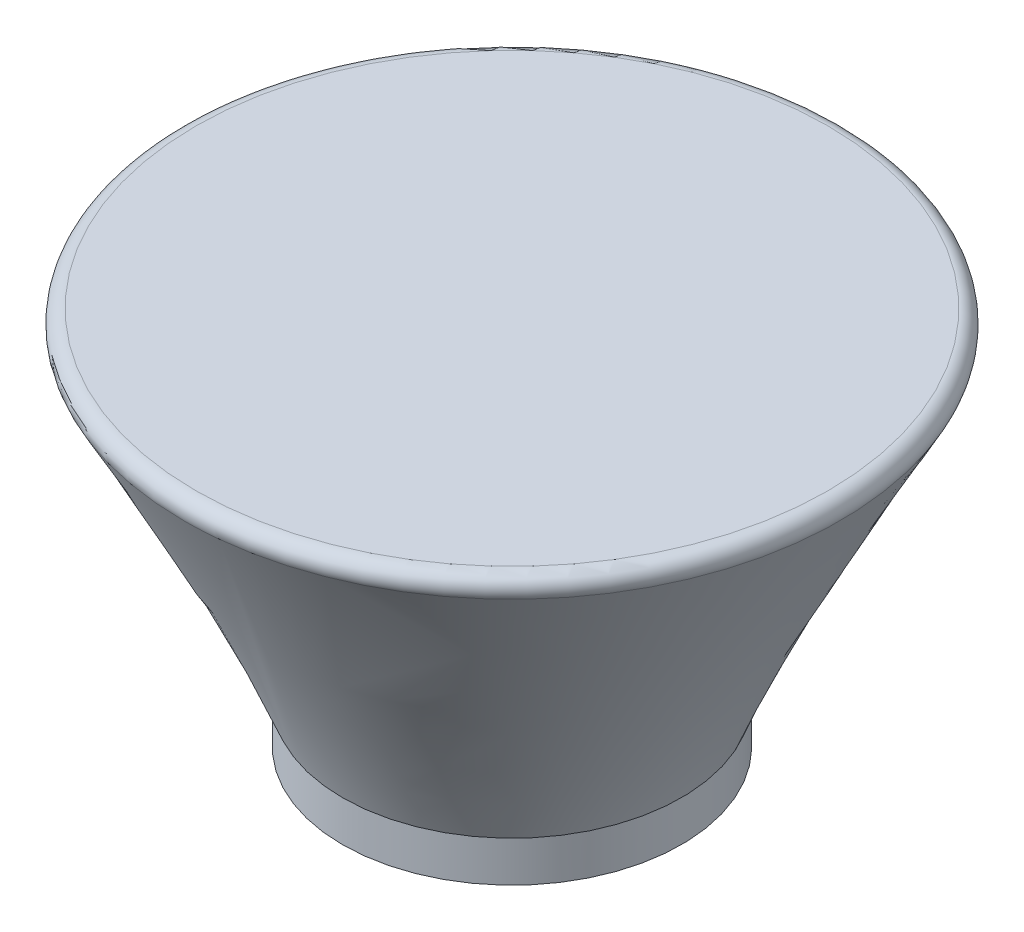
ISO-10303-21;
HEADER;
FILE_DESCRIPTION(('STEP AP214'),'2;1');
FILE_NAME('part.step','',(''),(''),'','','');
FILE_SCHEMA(('AUTOMOTIVE_DESIGN { 1 0 10303 214 1 1 1 1 }'));
ENDSEC;
DATA;
#1=APPLICATION_CONTEXT('core data for automotive mechanical design processes');
#2=APPLICATION_PROTOCOL_DEFINITION('international standard','automotive_design',2000,#1);
#3=PRODUCT_CONTEXT('',#1,'mechanical');
#4=PRODUCT('Part','Part','',(#3));
#5=PRODUCT_RELATED_PRODUCT_CATEGORY('part','',(#4));
#6=PRODUCT_DEFINITION_FORMATION('','',#4);
#7=PRODUCT_DEFINITION_CONTEXT('part definition',#1,'design');
#8=PRODUCT_DEFINITION('design','',#6,#7);
#9=PRODUCT_DEFINITION_SHAPE('','',#8);
#10=(LENGTH_UNIT() NAMED_UNIT(*) SI_UNIT(.MILLI.,.METRE.));
#11=(NAMED_UNIT(*) PLANE_ANGLE_UNIT() SI_UNIT($,.RADIAN.));
#12=(NAMED_UNIT(*) SI_UNIT($,.STERADIAN.) SOLID_ANGLE_UNIT());
#13=UNCERTAINTY_MEASURE_WITH_UNIT(LENGTH_MEASURE(1.E-05),#10,'distance_accuracy_value','');
#14=(GEOMETRIC_REPRESENTATION_CONTEXT(3) GLOBAL_UNCERTAINTY_ASSIGNED_CONTEXT((#13)) GLOBAL_UNIT_ASSIGNED_CONTEXT((#10,
#11,#12)) REPRESENTATION_CONTEXT('',''));
#15=CARTESIAN_POINT('',(0.,0.,0.));
#16=DIRECTION('',(0.,0.,1.));
#17=DIRECTION('',(1.,0.,0.));
#18=AXIS2_PLACEMENT_3D('',#15,#16,#17);
#19=CARTESIAN_POINT('',(0.,0.6,0.));
#20=DIRECTION('',(0.,-1.,0.));
#21=DIRECTION('',(0.,0.,-1.));
#22=AXIS2_PLACEMENT_3D('',#19,#20,#21);
#23=CYLINDRICAL_SURFACE('',#22,2.5);
#24=CARTESIAN_POINT('',(0.,0.6,0.));
#25=DIRECTION('',(0.,-1.,0.));
#26=DIRECTION('',(0.,0.,-1.));
#27=AXIS2_PLACEMENT_3D('',#24,#25,#26);
#28=CIRCLE('',#27,2.5);
#29=CARTESIAN_POINT('',(-0.886625195038503,0.6,2.33749775690223));
#30=VERTEX_POINT('',#29);
#31=EDGE_CURVE('E48',#30,#30,#28,.F.);
#32=ORIENTED_EDGE('',*,*,#31,.F.);
#33=EDGE_LOOP('',(#32));
#34=FACE_BOUND('',#33,.T.);
#35=CARTESIAN_POINT('',(0.,0.,0.));
#36=DIRECTION('',(0.,1.,0.));
#37=DIRECTION('',(0.,0.,1.));
#38=AXIS2_PLACEMENT_3D('',#35,#36,#37);
#39=CIRCLE('',#38,2.5);
#40=CARTESIAN_POINT('',(0.,0.,2.5));
#41=VERTEX_POINT('',#40);
#42=EDGE_CURVE('E52',#41,#41,#39,.T.);
#43=ORIENTED_EDGE('',*,*,#42,.T.);
#44=EDGE_LOOP('',(#43));
#45=FACE_BOUND('',#44,.T.);
#46=ADVANCED_FACE('F37',(#34,#45),#23,.T.);
#47=CARTESIAN_POINT('',(0.,0.,0.));
#48=DIRECTION('',(0.,1.,0.));
#49=DIRECTION('',(0.,0.,1.));
#50=AXIS2_PLACEMENT_3D('',#47,#48,#49);
#51=PLANE('',#50);
#52=ORIENTED_EDGE('',*,*,#42,.F.);
#53=EDGE_LOOP('',(#52));
#54=FACE_BOUND('',#53,.T.);
#55=ADVANCED_FACE('F61',(#54),#51,.F.);
#56=CARTESIAN_POINT('',(0.,5.6,0.));
#57=DIRECTION('',(0.,1.,0.));
#58=DIRECTION('',(0.,0.,1.));
#59=AXIS2_PLACEMENT_3D('',#56,#57,#58);
#60=PLANE('',#59);
#61=CARTESIAN_POINT('',(0.,5.6,0.));
#62=DIRECTION('',(0.,1.,0.));
#63=DIRECTION('',(0.,0.,1.));
#64=AXIS2_PLACEMENT_3D('',#61,#62,#63);
#65=CIRCLE('',#64,4.66046683141744);
#66=CARTESIAN_POINT('',(0.,5.6,4.66046683141744));
#67=VERTEX_POINT('',#66);
#68=EDGE_CURVE('E44',#67,#67,#65,.T.);
#69=ORIENTED_EDGE('',*,*,#68,.T.);
#70=EDGE_LOOP('',(#69));
#71=FACE_BOUND('',#70,.T.);
#72=ADVANCED_FACE('F63',(#71),#60,.T.);
#73=CARTESIAN_POINT('',(-0.886625195038503,0.6,2.33749775690223));
#74=CARTESIAN_POINT('',(0.573645482340107,5.6,4.96698408096813));
#75=CARTESIAN_POINT('',(3.78837031876595,0.6,4.11074814697923));
#76=CARTESIAN_POINT('',(10.5076136442764,5.6,3.81969311628791));
#77=CARTESIAN_POINT('',(5.56162070884296,0.6,-0.564247366825224));
#78=CARTESIAN_POINT('',(9.36032267959615,5.6,-6.11427504564834));
#79=CARTESIAN_POINT('',(0.886625195038501,0.6,-2.33749775690223));
#80=CARTESIAN_POINT('',(-0.573645482340107,5.6,-4.96698408096813));
#81=CARTESIAN_POINT('',(-3.78837031876595,0.6,-4.11074814697923));
#82=CARTESIAN_POINT('',(-10.5076136442764,5.6,-3.81969311628791));
#83=CARTESIAN_POINT('',(-5.56162070884295,0.6,0.564247366825225));
#84=CARTESIAN_POINT('',(-9.36032267959614,5.6,6.11427504564834));
#85=CARTESIAN_POINT('',(-0.886625195038503,0.6,2.33749775690223));
#86=CARTESIAN_POINT('',(0.573645482340107,5.6,4.96698408096813));
#87=(BOUNDED_SURFACE() B_SPLINE_SURFACE(3,1,((#73,#74),(#75,#76),(#77,#78),(#79,#80),(#81,#82),
(#83,#84),(#85,#86)),.UNSPECIFIED.,.T.,.F.,.F.) B_SPLINE_SURFACE_WITH_KNOTS((4,3,4),(2,2),(0.,
0.5,1.),(0.,1.),.UNSPECIFIED.) GEOMETRIC_REPRESENTATION_ITEM() RATIONAL_B_SPLINE_SURFACE(((1.,
1.),(0.333333333333333,0.333333333333333),(0.333333333333333,0.333333333333333),(1.,1.),
(0.333333333333333,0.333333333333334),(0.333333333333333,0.333333333333334),(1.,1.))) REPRESENTATION_ITEM('') SURFACE());
#88=CARTESIAN_POINT('',(0.,5.303262165014,0.));
#89=DIRECTION('',(0.,1.,0.));
#90=DIRECTION('',(0.,0.,1.));
#91=AXIS2_PLACEMENT_3D('',#88,#89,#90);
#92=CIRCLE('',#91,4.83551479993527);
#93=CARTESIAN_POINT('',(0.486981970480332,5.303262165014,4.8109304651824));
#94=VERTEX_POINT('',#93);
#95=EDGE_CURVE('E11',#94,#94,#92,.F.);
#96=CARTESIAN_POINT('',(0.486981970480332,5.303262165014,4.8109304651824));
#97=CARTESIAN_POINT('',(0.472673562506177,5.2542698507951,4.78516554113782));
#98=CARTESIAN_POINT('',(0.458365154532023,5.2052775365762,4.75940061709323));
#99=CARTESIAN_POINT('',(0.429748338583714,5.10729290813841,4.70787076900406));
#100=CARTESIAN_POINT('',(0.415439930609559,5.05830059391952,4.68210584495948));
#101=CARTESIAN_POINT('',(0.38682311466125,4.96031596548172,4.63057599687031));
#102=CARTESIAN_POINT('',(0.372514706687096,4.91132365126283,4.60481107282572));
#103=CARTESIAN_POINT('',(0.343897890738787,4.81333902282504,4.55328122473655));
#104=CARTESIAN_POINT('',(0.329589482764632,4.76434670860614,4.52751630069196));
#105=CARTESIAN_POINT('',(0.300972666816323,4.66636208016835,4.4759864526028));
#106=CARTESIAN_POINT('',(0.286664258842169,4.61736976594945,4.45022152855821));
#107=CARTESIAN_POINT('',(0.25804744289386,4.51938513751166,4.39869168046904));
#108=CARTESIAN_POINT('',(0.243739034919705,4.47039282329277,4.37292675642445));
#109=CARTESIAN_POINT('',(0.215122218971396,4.37240819485498,4.32139690833528));
#110=CARTESIAN_POINT('',(0.200813810997242,4.32341588063608,4.2956319842907));
#111=CARTESIAN_POINT('',(0.172196995048932,4.22543125219829,4.24410213620153));
#112=CARTESIAN_POINT('',(0.157888587074778,4.17643893797939,4.21833721215694));
#113=CARTESIAN_POINT('',(0.129271771126469,4.0784543095416,4.16680736406777));
#114=CARTESIAN_POINT('',(0.114963363152314,4.0294619953227,4.14104244002319));
#115=CARTESIAN_POINT('',(0.0863465472040052,3.93147736688491,4.08951259193402));
#116=CARTESIAN_POINT('',(0.0720381392298506,3.88248505266602,4.06374766788943));
#117=CARTESIAN_POINT('',(0.0434213232815415,3.78450042422823,4.01221781980026));
#118=CARTESIAN_POINT('',(0.0291129153073871,3.73550811000933,3.98645289575568));
#119=CARTESIAN_POINT('',(0.000496099359078064,3.63752348157154,3.93492304766651));
#120=CARTESIAN_POINT('',(-0.0138123086150765,3.58853116735264,3.90915812362192));
#121=CARTESIAN_POINT('',(-0.0424291245633856,3.49054653891485,3.85762827553275));
#122=CARTESIAN_POINT('',(-0.0567375325375402,3.44155422469596,3.83186335148817));
#123=CARTESIAN_POINT('',(-0.0853543484858492,3.34356959625816,3.78033350339899));
#124=CARTESIAN_POINT('',(-0.0996627564600037,3.29457728203927,3.75456857935441));
#125=CARTESIAN_POINT('',(-0.128279572408313,3.19659265360148,3.70303873126524));
#126=CARTESIAN_POINT('',(-0.142587980382467,3.14760033938258,3.67727380722065));
#127=CARTESIAN_POINT('',(-0.171204796330776,3.04961571094479,3.62574395913148));
#128=CARTESIAN_POINT('',(-0.185513204304931,3.00062339672589,3.5999790350869));
#129=CARTESIAN_POINT('',(-0.21413002025324,2.9026387682881,3.54844918699773));
#130=CARTESIAN_POINT('',(-0.228438428227394,2.85364645406921,3.52268426295314));
#131=CARTESIAN_POINT('',(-0.257055244175704,2.75566182563141,3.47115441486397));
#132=CARTESIAN_POINT('',(-0.271363652149858,2.70666951141252,3.44538949081939));
#133=CARTESIAN_POINT('',(-0.299980468098167,2.60868488297473,3.39385964273022));
#134=CARTESIAN_POINT('',(-0.314288876072322,2.55969256875583,3.36809471868563));
#135=CARTESIAN_POINT('',(-0.342905692020631,2.46170794031804,3.31656487059646));
#136=CARTESIAN_POINT('',(-0.357214099994785,2.41271562609914,3.29079994655188));
#137=CARTESIAN_POINT('',(-0.385830915943094,2.31473099766135,3.23927009846271));
#138=CARTESIAN_POINT('',(-0.400139323917249,2.26573868344246,3.21350517441812));
#139=CARTESIAN_POINT('',(-0.428756139865558,2.16775405500466,3.16197532632895));
#140=CARTESIAN_POINT('',(-0.443064547839712,2.11876174078577,3.13621040228437));
#141=CARTESIAN_POINT('',(-0.471681363788022,2.02077711234798,3.0846805541952));
#142=CARTESIAN_POINT('',(-0.485989771762176,1.97178479812908,3.05891563015061));
#143=CARTESIAN_POINT('',(-0.514606587710485,1.87380016969129,3.00738578206144));
#144=CARTESIAN_POINT('',(-0.52891499568464,1.82480785547239,2.98162085801685));
#145=CARTESIAN_POINT('',(-0.557531811632949,1.7268232270346,2.93009100992768));
#146=CARTESIAN_POINT('',(-0.571840219607103,1.67783091281571,2.9043260858831));
#147=CARTESIAN_POINT('',(-0.600457035555412,1.57984628437792,2.85279623779393));
#148=CARTESIAN_POINT('',(-0.614765443529567,1.53085397015902,2.82703131374934));
#149=CARTESIAN_POINT('',(-0.643382259477876,1.43286934172123,2.77550146566017));
#150=CARTESIAN_POINT('',(-0.65769066745203,1.38387702750233,2.74973654161559));
#151=CARTESIAN_POINT('',(-0.686307483400339,1.28589239906454,2.69820669352642));
#152=CARTESIAN_POINT('',(-0.700615891374494,1.23690008484565,2.67244176948183));
#153=CARTESIAN_POINT('',(-0.729232707322803,1.13891545640785,2.62091192139266));
#154=CARTESIAN_POINT('',(-0.743541115296958,1.08992314218896,2.59514699734808));
#155=CARTESIAN_POINT('',(-0.772157931245267,0.991938513751166,2.54361714925891));
#156=CARTESIAN_POINT('',(-0.786466339219421,0.942946199532271,2.51785222521432));
#157=CARTESIAN_POINT('',(-0.81508315516773,0.844961571094479,2.46632237712515));
#158=CARTESIAN_POINT('',(-0.829391563141885,0.795969256875583,2.44055745308057));
#159=CARTESIAN_POINT('',(-0.858008379090194,0.697984628437792,2.3890276049914));
#160=CARTESIAN_POINT('',(-0.872316787064348,0.648992314218896,2.36326268094681));
#161=CARTESIAN_POINT('',(-0.886625195038503,0.6,2.33749775690223));
#162=B_SPLINE_CURVE_WITH_KNOTS('',3,(#96,#97,#98,#99,#100,#101,#102,#103,#104,#105,#106,#107,
#108,#109,#110,#111,#112,#113,#114,#115,#116,#117,#118,#119,#120,#121,#122,#123,#124,#125,#126,
#127,#128,#129,#130,#131,#132,#133,#134,#135,#136,#137,#138,#139,#140,#141,#142,#143,#144,#145,
#146,#147,#148,#149,#150,#151,#152,#153,#154,#155,#156,#157,#158,#159,#160,#161),.UNSPECIFIED.,
.F.,.F.,(4,2,2,2,2,2,2,2,2,2,2,2,2,2,2,2,2,2,2,2,2,2,2,2,2,2,2,2,2,2,2,2,4),(0.,
0.171520489506968,0.343040979013937,0.514561468520904,0.686081958027873,0.857602447534841,
1.02912293704181,1.20064342654878,1.37216391605575,1.54368440556271,1.71520489506968,
1.88672538457665,2.05824587408362,2.22976636359059,2.40128685309756,2.57280734260452,
2.74432783211149,2.91584832161846,3.08736881112543,3.2588893006324,3.43040979013936,
3.60193027964633,3.7734507691533,3.94497125866027,4.11649174816724,4.28801223767421,
4.45953272718117,4.63105321668814,4.80257370619511,4.97409419570208,5.14561468520905,
5.31713517471601,5.48865566422298),.UNSPECIFIED.);
#163=EDGE_CURVE('BSEAM69',#94,#30,#162,.T.);
#164=ORIENTED_EDGE('',*,*,#95,.T.);
#165=ORIENTED_EDGE('',*,*,#31,.T.);
#166=ORIENTED_EDGE('',*,*,#163,.T.);
#167=ORIENTED_EDGE('',*,*,#163,.F.);
#168=EDGE_LOOP('',(#164,#166,#165,#167));
#169=FACE_BOUND('',#168,.T.);
#170=ADVANCED_FACE('F69',(#169),#87,.T.);
#171=CARTESIAN_POINT('',(0.,5.4,0.));
#172=DIRECTION('',(0.,1.,0.));
#173=DIRECTION('',(0.,0.,1.));
#174=AXIS2_PLACEMENT_3D('',#171,#172,#173);
#175=TOROIDAL_SURFACE('',#174,4.66046683141744,0.2);
#176=ORIENTED_EDGE('',*,*,#95,.F.);
#177=EDGE_LOOP('',(#176));
#178=FACE_BOUND('',#177,.T.);
#179=ORIENTED_EDGE('',*,*,#68,.F.);
#180=EDGE_LOOP('',(#179));
#181=FACE_BOUND('',#180,.T.);
#182=ADVANCED_FACE('F39',(#178,#181),#175,.T.);
#183=CLOSED_SHELL('',(#46,#55,#72,#170,#182));
#184=MANIFOLD_SOLID_BREP('B2',#183);
#185=ADVANCED_BREP_SHAPE_REPRESENTATION('',(#18,#184),#14);
#186=SHAPE_DEFINITION_REPRESENTATION(#9,#185);
ENDSEC;
END-ISO-10303-21;
